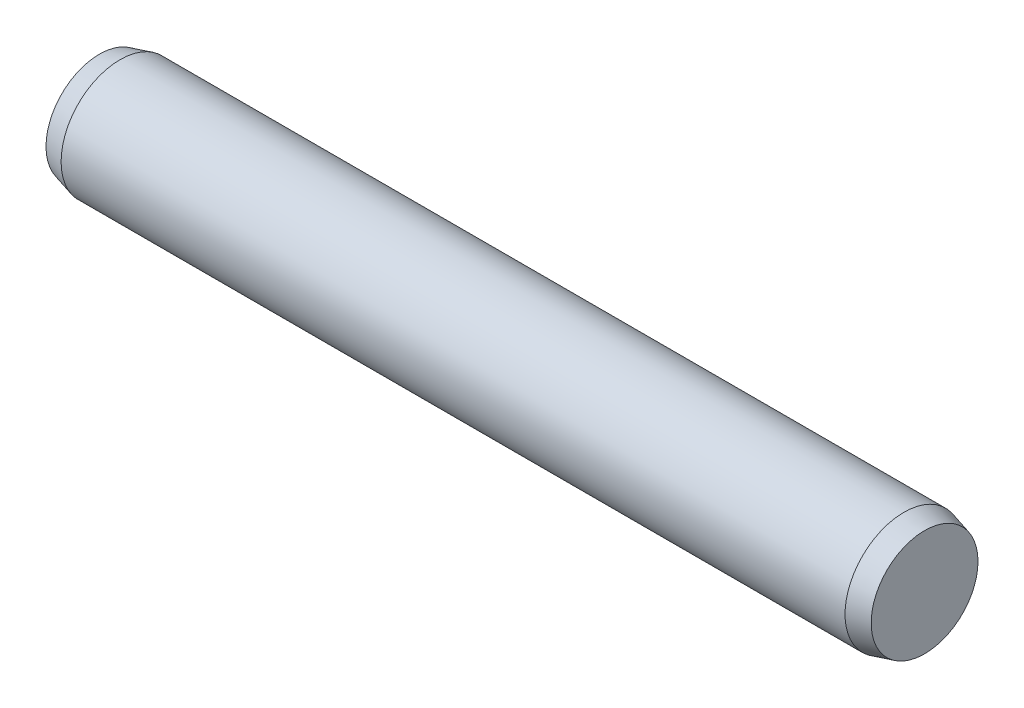
ISO-10303-21;
HEADER;
FILE_DESCRIPTION(('STEP AP214'),'2;1');
FILE_NAME('part.step','',(''),(''),'','','');
FILE_SCHEMA(('AUTOMOTIVE_DESIGN { 1 0 10303 214 1 1 1 1 }'));
ENDSEC;
DATA;
#1=APPLICATION_CONTEXT('core data for automotive mechanical design processes');
#2=APPLICATION_PROTOCOL_DEFINITION('international standard','automotive_design',2000,#1);
#3=PRODUCT_CONTEXT('',#1,'mechanical');
#4=PRODUCT('Part','Part','',(#3));
#5=PRODUCT_RELATED_PRODUCT_CATEGORY('part','',(#4));
#6=PRODUCT_DEFINITION_FORMATION('','',#4);
#7=PRODUCT_DEFINITION_CONTEXT('part definition',#1,'design');
#8=PRODUCT_DEFINITION('design','',#6,#7);
#9=PRODUCT_DEFINITION_SHAPE('','',#8);
#10=(LENGTH_UNIT() NAMED_UNIT(*) SI_UNIT(.MILLI.,.METRE.));
#11=(NAMED_UNIT(*) PLANE_ANGLE_UNIT() SI_UNIT($,.RADIAN.));
#12=(NAMED_UNIT(*) SI_UNIT($,.STERADIAN.) SOLID_ANGLE_UNIT());
#13=UNCERTAINTY_MEASURE_WITH_UNIT(LENGTH_MEASURE(1.E-05),#10,'distance_accuracy_value','');
#14=(GEOMETRIC_REPRESENTATION_CONTEXT(3) GLOBAL_UNCERTAINTY_ASSIGNED_CONTEXT((#13)) GLOBAL_UNIT_ASSIGNED_CONTEXT((#10,
#11,#12)) REPRESENTATION_CONTEXT('',''));
#15=CARTESIAN_POINT('',(0.,0.,0.));
#16=DIRECTION('',(0.,0.,1.));
#17=DIRECTION('',(1.,0.,0.));
#18=AXIS2_PLACEMENT_3D('',#15,#16,#17);
#19=CARTESIAN_POINT('',(-6.65,0.,0.));
#20=DIRECTION('',(1.,0.,0.));
#21=DIRECTION('',(0.,0.,-1.));
#22=AXIS2_PLACEMENT_3D('',#19,#20,#21);
#23=CYLINDRICAL_SURFACE('',#22,1.);
#24=CARTESIAN_POINT('',(-6.65,0.,0.));
#25=DIRECTION('',(-1.,0.,0.));
#26=DIRECTION('',(0.,0.,1.));
#27=AXIS2_PLACEMENT_3D('',#24,#25,#26);
#28=CIRCLE('',#27,1.);
#29=CARTESIAN_POINT('',(-6.65,0.,1.));
#30=VERTEX_POINT('',#29);
#31=EDGE_CURVE('E44',#30,#30,#28,.T.);
#32=ORIENTED_EDGE('',*,*,#31,.F.);
#33=EDGE_LOOP('',(#32));
#34=FACE_BOUND('',#33,.T.);
#35=CARTESIAN_POINT('',(6.65,0.,0.));
#36=DIRECTION('',(1.,0.,0.));
#37=DIRECTION('',(0.,0.,-1.));
#38=AXIS2_PLACEMENT_3D('',#35,#36,#37);
#39=CIRCLE('',#38,1.);
#40=CARTESIAN_POINT('',(6.65,0.,-1.));
#41=VERTEX_POINT('',#40);
#42=EDGE_CURVE('E10',#41,#41,#39,.T.);
#43=ORIENTED_EDGE('',*,*,#42,.F.);
#44=EDGE_LOOP('',(#43));
#45=FACE_BOUND('',#44,.T.);
#46=ADVANCED_FACE('F30',(#34,#45),#23,.T.);
#47=CARTESIAN_POINT('',(6.65,0.,0.));
#48=DIRECTION('',(-1.,0.,0.));
#49=DIRECTION('',(0.,0.,-1.));
#50=AXIS2_PLACEMENT_3D('',#47,#48,#49);
#51=CONICAL_SURFACE('',#50,1.,0.26179938779915);
#52=CARTESIAN_POINT('',(7.,0.,0.));
#53=DIRECTION('',(1.,0.,0.));
#54=DIRECTION('',(0.,0.,-1.));
#55=AXIS2_PLACEMENT_3D('',#52,#53,#54);
#56=CIRCLE('',#55,0.906217782649108);
#57=CARTESIAN_POINT('',(7.,0.,-0.906217782649108));
#58=VERTEX_POINT('',#57);
#59=EDGE_CURVE('E36',#58,#58,#56,.T.);
#60=ORIENTED_EDGE('',*,*,#59,.F.);
#61=EDGE_LOOP('',(#60));
#62=FACE_BOUND('',#61,.T.);
#63=ORIENTED_EDGE('',*,*,#42,.T.);
#64=EDGE_LOOP('',(#63));
#65=FACE_BOUND('',#64,.T.);
#66=ADVANCED_FACE('F54',(#62,#65),#51,.T.);
#67=CARTESIAN_POINT('',(7.,0.,0.));
#68=DIRECTION('',(1.,0.,0.));
#69=DIRECTION('',(0.,0.,-1.));
#70=AXIS2_PLACEMENT_3D('',#67,#68,#69);
#71=PLANE('',#70);
#72=ORIENTED_EDGE('',*,*,#59,.T.);
#73=EDGE_LOOP('',(#72));
#74=FACE_BOUND('',#73,.T.);
#75=ADVANCED_FACE('F58',(#74),#71,.T.);
#76=CARTESIAN_POINT('',(-6.65,0.,0.));
#77=DIRECTION('',(1.,0.,0.));
#78=DIRECTION('',(0.,0.,1.));
#79=AXIS2_PLACEMENT_3D('',#76,#77,#78);
#80=CONICAL_SURFACE('',#79,1.,0.26179938779915);
#81=CARTESIAN_POINT('',(-7.,0.,0.));
#82=DIRECTION('',(-1.,0.,0.));
#83=DIRECTION('',(0.,0.,1.));
#84=AXIS2_PLACEMENT_3D('',#81,#82,#83);
#85=CIRCLE('',#84,0.906217782649108);
#86=CARTESIAN_POINT('',(-7.,0.,0.906217782649108));
#87=VERTEX_POINT('',#86);
#88=EDGE_CURVE('E40',#87,#87,#85,.T.);
#89=ORIENTED_EDGE('',*,*,#88,.F.);
#90=EDGE_LOOP('',(#89));
#91=FACE_BOUND('',#90,.T.);
#92=ORIENTED_EDGE('',*,*,#31,.T.);
#93=EDGE_LOOP('',(#92));
#94=FACE_BOUND('',#93,.T.);
#95=ADVANCED_FACE('F50',(#91,#94),#80,.T.);
#96=CARTESIAN_POINT('',(-7.,0.,0.));
#97=DIRECTION('',(-1.,0.,0.));
#98=DIRECTION('',(0.,0.,1.));
#99=AXIS2_PLACEMENT_3D('',#96,#97,#98);
#100=PLANE('',#99);
#101=ORIENTED_EDGE('',*,*,#88,.T.);
#102=EDGE_LOOP('',(#101));
#103=FACE_BOUND('',#102,.T.);
#104=ADVANCED_FACE('F67',(#103),#100,.T.);
#105=CLOSED_SHELL('',(#46,#66,#75,#95,#104));
#106=MANIFOLD_SOLID_BREP('B2',#105);
#107=ADVANCED_BREP_SHAPE_REPRESENTATION('',(#18,#106),#14);
#108=SHAPE_DEFINITION_REPRESENTATION(#9,#107);
ENDSEC;
END-ISO-10303-21;
